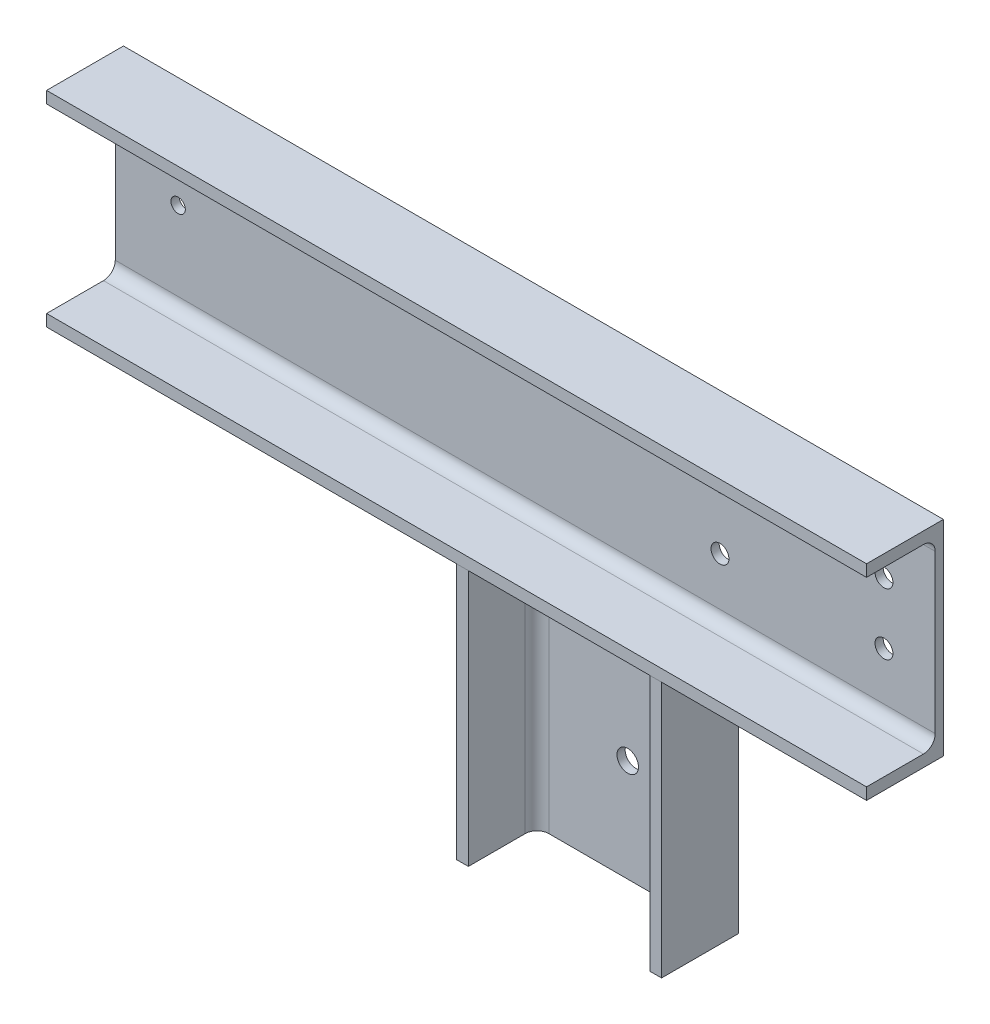
ISO-10303-21;
HEADER;
FILE_DESCRIPTION(('STEP AP214'),'2;1');
FILE_NAME('part.step','',(''),(''),'','','');
FILE_SCHEMA(('AUTOMOTIVE_DESIGN { 1 0 10303 214 1 1 1 1 }'));
ENDSEC;
DATA;
#1=APPLICATION_CONTEXT('core data for automotive mechanical design processes');
#2=APPLICATION_PROTOCOL_DEFINITION('international standard','automotive_design',2000,#1);
#3=PRODUCT_CONTEXT('',#1,'mechanical');
#4=PRODUCT('Part','Part','',(#3));
#5=PRODUCT_RELATED_PRODUCT_CATEGORY('part','',(#4));
#6=PRODUCT_DEFINITION_FORMATION('','',#4);
#7=PRODUCT_DEFINITION_CONTEXT('part definition',#1,'design');
#8=PRODUCT_DEFINITION('design','',#6,#7);
#9=PRODUCT_DEFINITION_SHAPE('','',#8);
#10=(LENGTH_UNIT() NAMED_UNIT(*) SI_UNIT(.MILLI.,.METRE.));
#11=(NAMED_UNIT(*) PLANE_ANGLE_UNIT() SI_UNIT($,.RADIAN.));
#12=(NAMED_UNIT(*) SI_UNIT($,.STERADIAN.) SOLID_ANGLE_UNIT());
#13=UNCERTAINTY_MEASURE_WITH_UNIT(LENGTH_MEASURE(1.E-05),#10,'distance_accuracy_value','');
#14=(GEOMETRIC_REPRESENTATION_CONTEXT(3) GLOBAL_UNCERTAINTY_ASSIGNED_CONTEXT((#13)) GLOBAL_UNIT_ASSIGNED_CONTEXT((#10,
#11,#12)) REPRESENTATION_CONTEXT('',''));
#15=CARTESIAN_POINT('',(0.,0.,0.));
#16=DIRECTION('',(0.,0.,1.));
#17=DIRECTION('',(1.,0.,0.));
#18=AXIS2_PLACEMENT_3D('',#15,#16,#17);
#19=CARTESIAN_POINT('',(200.,-250.,75.));
#20=DIRECTION('',(-1.,0.,0.));
#21=DIRECTION('',(0.,0.,1.));
#22=AXIS2_PLACEMENT_3D('',#19,#20,#21);
#23=PLANE('',#22);
#24=DIRECTION('',(0.,0.,1.));
#25=VECTOR('',#24,1.);
#26=CARTESIAN_POINT('',(200.,0.,75.));
#27=LINE('',#26,#25);
#28=CARTESIAN_POINT('',(200.,0.,0.));
#29=VERTEX_POINT('',#28);
#30=CARTESIAN_POINT('',(200.,0.,75.));
#31=VERTEX_POINT('',#30);
#32=EDGE_CURVE('E221',#29,#31,#27,.T.);
#33=ORIENTED_EDGE('',*,*,#32,.T.);
#34=DIRECTION('',(0.,1.,0.));
#35=VECTOR('',#34,1.);
#36=CARTESIAN_POINT('',(200.,-250.,75.));
#37=LINE('',#36,#35);
#38=CARTESIAN_POINT('',(200.,-250.,75.));
#39=VERTEX_POINT('',#38);
#40=EDGE_CURVE('E14',#39,#31,#37,.T.);
#41=ORIENTED_EDGE('',*,*,#40,.F.);
#42=DIRECTION('',(0.,0.,1.));
#43=VECTOR('',#42,1.);
#44=CARTESIAN_POINT('',(200.,-250.,75.));
#45=LINE('',#44,#43);
#46=CARTESIAN_POINT('',(200.,-250.,0.));
#47=VERTEX_POINT('',#46);
#48=EDGE_CURVE('E240',#47,#39,#45,.T.);
#49=ORIENTED_EDGE('',*,*,#48,.F.);
#50=DIRECTION('',(0.,1.,0.));
#51=VECTOR('',#50,1.);
#52=CARTESIAN_POINT('',(200.,-250.,0.));
#53=LINE('',#52,#51);
#54=EDGE_CURVE('E217',#47,#29,#53,.T.);
#55=ORIENTED_EDGE('',*,*,#54,.T.);
#56=EDGE_LOOP('',(#33,#41,#49,#55));
#57=FACE_BOUND('',#56,.T.);
#58=ADVANCED_FACE('F113',(#57),#23,.F.);
#59=CARTESIAN_POINT('',(200.,-250.,75.));
#60=DIRECTION('',(0.,0.,-1.));
#61=DIRECTION('',(-1.,0.,0.));
#62=AXIS2_PLACEMENT_3D('',#59,#60,#61);
#63=PLANE('',#62);
#64=DIRECTION('',(-1.,0.,0.));
#65=VECTOR('',#64,1.);
#66=CARTESIAN_POINT('',(200.,0.,75.));
#67=LINE('',#66,#65);
#68=CARTESIAN_POINT('',(188.5,0.,74.9999999999999));
#69=VERTEX_POINT('',#68);
#70=EDGE_CURVE('E224',#31,#69,#67,.T.);
#71=ORIENTED_EDGE('',*,*,#70,.T.);
#72=DIRECTION('',(0.,1.,0.));
#73=VECTOR('',#72,1.);
#74=CARTESIAN_POINT('',(188.5,-250.,74.9999999999999));
#75=LINE('',#74,#73);
#76=CARTESIAN_POINT('',(188.5,-250.,74.9999999999999));
#77=VERTEX_POINT('',#76);
#78=EDGE_CURVE('E121',#77,#69,#75,.T.);
#79=ORIENTED_EDGE('',*,*,#78,.F.);
#80=DIRECTION('',(-1.,0.,0.));
#81=VECTOR('',#80,1.);
#82=CARTESIAN_POINT('',(200.,-250.,75.));
#83=LINE('',#82,#81);
#84=EDGE_CURVE('E178',#39,#77,#83,.T.);
#85=ORIENTED_EDGE('',*,*,#84,.F.);
#86=ORIENTED_EDGE('',*,*,#40,.T.);
#87=EDGE_LOOP('',(#71,#79,#85,#86));
#88=FACE_BOUND('',#87,.T.);
#89=ADVANCED_FACE('F307',(#88),#63,.F.);
#90=CARTESIAN_POINT('',(188.5,-250.,19.4999999999999));
#91=DIRECTION('',(1.,0.,0.));
#92=DIRECTION('',(0.,0.,-1.));
#93=AXIS2_PLACEMENT_3D('',#90,#91,#92);
#94=PLANE('',#93);
#95=DIRECTION('',(0.,0.,-1.));
#96=VECTOR('',#95,1.);
#97=CARTESIAN_POINT('',(188.5,0.,19.4999999999999));
#98=LINE('',#97,#96);
#99=CARTESIAN_POINT('',(188.5,0.,19.4999999999999));
#100=VERTEX_POINT('',#99);
#101=EDGE_CURVE('E227',#69,#100,#98,.T.);
#102=ORIENTED_EDGE('',*,*,#101,.T.);
#103=DIRECTION('',(0.,1.,0.));
#104=VECTOR('',#103,1.);
#105=CARTESIAN_POINT('',(188.5,-250.,19.4999999999999));
#106=LINE('',#105,#104);
#107=CARTESIAN_POINT('',(188.5,-250.,19.4999999999999));
#108=VERTEX_POINT('',#107);
#109=EDGE_CURVE('E253',#108,#100,#106,.T.);
#110=ORIENTED_EDGE('',*,*,#109,.F.);
#111=DIRECTION('',(0.,0.,-1.));
#112=VECTOR('',#111,1.);
#113=CARTESIAN_POINT('',(188.5,-250.,19.4999999999999));
#114=LINE('',#113,#112);
#115=EDGE_CURVE('E261',#77,#108,#114,.T.);
#116=ORIENTED_EDGE('',*,*,#115,.F.);
#117=ORIENTED_EDGE('',*,*,#78,.T.);
#118=EDGE_LOOP('',(#102,#110,#116,#117));
#119=FACE_BOUND('',#118,.T.);
#120=ADVANCED_FACE('F259',(#119),#94,.F.);
#121=CARTESIAN_POINT('',(177.,-250.,19.4999999999999));
#122=DIRECTION('',(0.,1.,0.));
#123=DIRECTION('',(-1.,0.,0.));
#124=AXIS2_PLACEMENT_3D('',#121,#122,#123);
#125=CYLINDRICAL_SURFACE('',#124,11.5);
#126=CARTESIAN_POINT('',(177.,0.,19.4999999999999));
#127=DIRECTION('',(0.,1.,0.));
#128=DIRECTION('',(-1.,0.,0.));
#129=AXIS2_PLACEMENT_3D('',#126,#127,#128);
#130=CIRCLE('',#129,11.5);
#131=CARTESIAN_POINT('',(177.,0.,7.9999999999999));
#132=VERTEX_POINT('',#131);
#133=EDGE_CURVE('E229',#100,#132,#130,.T.);
#134=ORIENTED_EDGE('',*,*,#133,.T.);
#135=DIRECTION('',(0.,1.,0.));
#136=VECTOR('',#135,1.);
#137=CARTESIAN_POINT('',(177.,-250.,7.9999999999999));
#138=LINE('',#137,#136);
#139=CARTESIAN_POINT('',(177.,-250.,7.9999999999999));
#140=VERTEX_POINT('',#139);
#141=EDGE_CURVE('E250',#140,#132,#138,.T.);
#142=ORIENTED_EDGE('',*,*,#141,.F.);
#143=CARTESIAN_POINT('',(177.,-250.,19.4999999999999));
#144=DIRECTION('',(0.,1.,0.));
#145=DIRECTION('',(-1.,0.,0.));
#146=AXIS2_PLACEMENT_3D('',#143,#144,#145);
#147=CIRCLE('',#146,11.5);
#148=EDGE_CURVE('E279',#108,#140,#147,.T.);
#149=ORIENTED_EDGE('',*,*,#148,.F.);
#150=ORIENTED_EDGE('',*,*,#109,.T.);
#151=EDGE_LOOP('',(#134,#142,#149,#150));
#152=FACE_BOUND('',#151,.T.);
#153=ADVANCED_FACE('F270',(#152),#125,.F.);
#154=CARTESIAN_POINT('',(23.0000000000001,-250.,7.99999999999934));
#155=DIRECTION('',(0.,0.,-1.));
#156=DIRECTION('',(-1.,0.,0.));
#157=AXIS2_PLACEMENT_3D('',#154,#155,#156);
#158=PLANE('',#157);
#159=CARTESIAN_POINT('',(100.,-150.,7.99999999999925));
#160=DIRECTION('',(0.,0.,1.));
#161=DIRECTION('',(1.,0.,0.));
#162=AXIS2_PLACEMENT_3D('',#159,#160,#161);
#163=CIRCLE('',#162,10.5);
#164=CARTESIAN_POINT('',(110.5,-150.,7.99999999999925));
#165=VERTEX_POINT('',#164);
#166=EDGE_CURVE('E289',#165,#165,#163,.T.);
#167=ORIENTED_EDGE('',*,*,#166,.F.);
#168=EDGE_LOOP('',(#167));
#169=FACE_BOUND('',#168,.T.);
#170=DIRECTION('',(-1.,0.,0.));
#171=VECTOR('',#170,1.);
#172=CARTESIAN_POINT('',(23.,-1.15201697244113E-13,7.99999999999934));
#173=LINE('',#172,#171);
#174=CARTESIAN_POINT('',(23.,-1.15201697244113E-13,7.99999999999932));
#175=VERTEX_POINT('',#174);
#176=EDGE_CURVE('E231',#132,#175,#173,.T.);
#177=ORIENTED_EDGE('',*,*,#176,.T.);
#178=DIRECTION('',(0.,1.,0.));
#179=VECTOR('',#178,1.);
#180=CARTESIAN_POINT('',(23.0000000000001,-250.,7.99999999999932));
#181=LINE('',#180,#179);
#182=CARTESIAN_POINT('',(23.0000000000001,-250.,7.99999999999932));
#183=VERTEX_POINT('',#182);
#184=EDGE_CURVE('E247',#183,#175,#181,.T.);
#185=ORIENTED_EDGE('',*,*,#184,.F.);
#186=DIRECTION('',(-1.,0.,0.));
#187=VECTOR('',#186,1.);
#188=CARTESIAN_POINT('',(23.0000000000001,-250.,7.99999999999934));
#189=LINE('',#188,#187);
#190=EDGE_CURVE('E276',#140,#183,#189,.T.);
#191=ORIENTED_EDGE('',*,*,#190,.F.);
#192=ORIENTED_EDGE('',*,*,#141,.T.);
#193=EDGE_LOOP('',(#177,#185,#191,#192));
#194=FACE_BOUND('',#193,.T.);
#195=ADVANCED_FACE('F274',(#169,#194),#158,.F.);
#196=CARTESIAN_POINT('',(23.0000000000001,-250.,19.4999999999993));
#197=DIRECTION('',(0.,1.,0.));
#198=DIRECTION('',(-1.,0.,0.));
#199=AXIS2_PLACEMENT_3D('',#196,#197,#198);
#200=CYLINDRICAL_SURFACE('',#199,11.5);
#201=CARTESIAN_POINT('',(23.,-1.15201697244113E-13,19.4999999999993));
#202=DIRECTION('',(0.,1.,0.));
#203=DIRECTION('',(-1.,0.,0.));
#204=AXIS2_PLACEMENT_3D('',#201,#202,#203);
#205=CIRCLE('',#204,11.5);
#206=CARTESIAN_POINT('',(11.5,-1.17116831961591E-13,19.4999999999993));
#207=VERTEX_POINT('',#206);
#208=EDGE_CURVE('E233',#175,#207,#205,.T.);
#209=ORIENTED_EDGE('',*,*,#208,.T.);
#210=DIRECTION('',(0.,1.,0.));
#211=VECTOR('',#210,1.);
#212=CARTESIAN_POINT('',(11.5,-250.,19.4999999999993));
#213=LINE('',#212,#211);
#214=CARTESIAN_POINT('',(11.5,-250.,19.4999999999993));
#215=VERTEX_POINT('',#214);
#216=EDGE_CURVE('E244',#215,#207,#213,.T.);
#217=ORIENTED_EDGE('',*,*,#216,.F.);
#218=CARTESIAN_POINT('',(23.0000000000001,-250.,19.4999999999993));
#219=DIRECTION('',(0.,1.,0.));
#220=DIRECTION('',(-1.,0.,0.));
#221=AXIS2_PLACEMENT_3D('',#218,#219,#220);
#222=CIRCLE('',#221,11.5);
#223=EDGE_CURVE('E278',#183,#215,#222,.T.);
#224=ORIENTED_EDGE('',*,*,#223,.F.);
#225=ORIENTED_EDGE('',*,*,#184,.T.);
#226=EDGE_LOOP('',(#209,#217,#224,#225));
#227=FACE_BOUND('',#226,.T.);
#228=ADVANCED_FACE('F296',(#227),#200,.F.);
#229=CARTESIAN_POINT('',(11.5,-250.,19.4999999999993));
#230=DIRECTION('',(-1.,0.,0.));
#231=DIRECTION('',(0.,0.,1.));
#232=AXIS2_PLACEMENT_3D('',#229,#230,#231);
#233=PLANE('',#232);
#234=DIRECTION('',(0.,0.,1.));
#235=VECTOR('',#234,1.);
#236=CARTESIAN_POINT('',(11.5,-1.17116831961591E-13,19.4999999999993));
#237=LINE('',#236,#235);
#238=CARTESIAN_POINT('',(11.4999999999998,-1.17116831961591E-13,74.9999999999993));
#239=VERTEX_POINT('',#238);
#240=EDGE_CURVE('E235',#207,#239,#237,.T.);
#241=ORIENTED_EDGE('',*,*,#240,.T.);
#242=DIRECTION('',(0.,1.,0.));
#243=VECTOR('',#242,1.);
#244=CARTESIAN_POINT('',(11.4999999999998,-250.,74.9999999999993));
#245=LINE('',#244,#243);
#246=CARTESIAN_POINT('',(11.4999999999998,-250.,74.9999999999993));
#247=VERTEX_POINT('',#246);
#248=EDGE_CURVE('E212',#247,#239,#245,.T.);
#249=ORIENTED_EDGE('',*,*,#248,.F.);
#250=DIRECTION('',(0.,0.,1.));
#251=VECTOR('',#250,1.);
#252=CARTESIAN_POINT('',(11.5,-250.,19.4999999999993));
#253=LINE('',#252,#251);
#254=EDGE_CURVE('E203',#215,#247,#253,.T.);
#255=ORIENTED_EDGE('',*,*,#254,.F.);
#256=ORIENTED_EDGE('',*,*,#216,.T.);
#257=EDGE_LOOP('',(#241,#249,#255,#256));
#258=FACE_BOUND('',#257,.T.);
#259=ADVANCED_FACE('F302',(#258),#233,.F.);
#260=CARTESIAN_POINT('',(-1.52655665885959E-13,-250.,74.9999999999992));
#261=DIRECTION('',(0.,0.,-1.));
#262=DIRECTION('',(-1.,0.,0.));
#263=AXIS2_PLACEMENT_3D('',#260,#261,#262);
#264=PLANE('',#263);
#265=DIRECTION('',(-1.,0.,0.));
#266=VECTOR('',#265,1.);
#267=CARTESIAN_POINT('',(-1.94289029309402E-13,-1.19031966679069E-13,74.9999999999992));
#268=LINE('',#267,#266);
#269=CARTESIAN_POINT('',(-1.94289029309402E-13,-1.19031966679069E-13,74.9999999999992));
#270=VERTEX_POINT('',#269);
#271=EDGE_CURVE('E211',#239,#270,#268,.T.);
#272=ORIENTED_EDGE('',*,*,#271,.T.);
#273=DIRECTION('',(0.,1.,0.));
#274=VECTOR('',#273,1.);
#275=CARTESIAN_POINT('',(-1.52655665885959E-13,-250.,74.9999999999992));
#276=LINE('',#275,#274);
#277=CARTESIAN_POINT('',(-1.52655665885959E-13,-250.,74.9999999999992));
#278=VERTEX_POINT('',#277);
#279=EDGE_CURVE('E208',#278,#270,#276,.T.);
#280=ORIENTED_EDGE('',*,*,#279,.F.);
#281=DIRECTION('',(-1.,0.,0.));
#282=VECTOR('',#281,1.);
#283=CARTESIAN_POINT('',(-1.52655665885959E-13,-250.,74.9999999999992));
#284=LINE('',#283,#282);
#285=EDGE_CURVE('E197',#247,#278,#284,.T.);
#286=ORIENTED_EDGE('',*,*,#285,.F.);
#287=ORIENTED_EDGE('',*,*,#248,.T.);
#288=EDGE_LOOP('',(#272,#280,#286,#287));
#289=FACE_BOUND('',#288,.T.);
#290=ADVANCED_FACE('F209',(#289),#264,.F.);
#291=CARTESIAN_POINT('',(-1.52655665885959E-13,-250.,74.9999999999992));
#292=DIRECTION('',(1.,0.,0.));
#293=DIRECTION('',(0.,0.,-1.));
#294=AXIS2_PLACEMENT_3D('',#291,#292,#293);
#295=PLANE('',#294);
#296=DIRECTION('',(0.,0.,-1.));
#297=VECTOR('',#296,1.);
#298=CARTESIAN_POINT('',(-1.94289029309402E-13,-1.19031966679069E-13,74.9999999999992));
#299=LINE('',#298,#297);
#300=CARTESIAN_POINT('',(0.,-1.19031966679069E-13,-7.53807418999884E-13));
#301=VERTEX_POINT('',#300);
#302=EDGE_CURVE('E164',#270,#301,#299,.T.);
#303=ORIENTED_EDGE('',*,*,#302,.T.);
#304=DIRECTION('',(0.,1.,0.));
#305=VECTOR('',#304,1.);
#306=CARTESIAN_POINT('',(0.,-250.,-7.53807418999884E-13));
#307=LINE('',#306,#305);
#308=CARTESIAN_POINT('',(0.,-250.,-7.53807418999884E-13));
#309=VERTEX_POINT('',#308);
#310=EDGE_CURVE('E213',#309,#301,#307,.T.);
#311=ORIENTED_EDGE('',*,*,#310,.F.);
#312=DIRECTION('',(0.,0.,-1.));
#313=VECTOR('',#312,1.);
#314=CARTESIAN_POINT('',(-1.52655665885959E-13,-250.,74.9999999999992));
#315=LINE('',#314,#313);
#316=EDGE_CURVE('E201',#278,#309,#315,.T.);
#317=ORIENTED_EDGE('',*,*,#316,.F.);
#318=ORIENTED_EDGE('',*,*,#279,.T.);
#319=EDGE_LOOP('',(#303,#311,#317,#318));
#320=FACE_BOUND('',#319,.T.);
#321=ADVANCED_FACE('F215',(#320),#295,.F.);
#322=CARTESIAN_POINT('',(200.,-250.,0.));
#323=DIRECTION('',(0.,0.,1.));
#324=DIRECTION('',(1.,0.,0.));
#325=AXIS2_PLACEMENT_3D('',#322,#323,#324);
#326=PLANE('',#325);
#327=CARTESIAN_POINT('',(100.,-150.,-7.56339435525888E-13));
#328=DIRECTION('',(0.,0.,1.));
#329=DIRECTION('',(1.,0.,0.));
#330=AXIS2_PLACEMENT_3D('',#327,#328,#329);
#331=CIRCLE('',#330,10.5);
#332=CARTESIAN_POINT('',(110.5,-150.,-7.56339435525888E-13));
#333=VERTEX_POINT('',#332);
#334=EDGE_CURVE('E225',#333,#333,#331,.T.);
#335=ORIENTED_EDGE('',*,*,#334,.T.);
#336=EDGE_LOOP('',(#335));
#337=FACE_BOUND('',#336,.T.);
#338=DIRECTION('',(1.,0.,0.));
#339=VECTOR('',#338,1.);
#340=CARTESIAN_POINT('',(200.,0.,0.));
#341=LINE('',#340,#339);
#342=EDGE_CURVE('E170',#301,#29,#341,.T.);
#343=ORIENTED_EDGE('',*,*,#342,.T.);
#344=ORIENTED_EDGE('',*,*,#54,.F.);
#345=DIRECTION('',(1.,0.,0.));
#346=VECTOR('',#345,1.);
#347=CARTESIAN_POINT('',(200.,-250.,0.));
#348=LINE('',#347,#346);
#349=EDGE_CURVE('E129',#309,#47,#348,.T.);
#350=ORIENTED_EDGE('',*,*,#349,.F.);
#351=ORIENTED_EDGE('',*,*,#310,.T.);
#352=EDGE_LOOP('',(#343,#344,#350,#351));
#353=FACE_BOUND('',#352,.T.);
#354=ADVANCED_FACE('F326',(#337,#353),#326,.F.);
#355=CARTESIAN_POINT('',(23.0000000000001,-250.,19.4999999999993));
#356=DIRECTION('',(0.,1.,0.));
#357=DIRECTION('',(-1.,0.,0.));
#358=AXIS2_PLACEMENT_3D('',#355,#356,#357);
#359=PLANE('',#358);
#360=ORIENTED_EDGE('',*,*,#48,.T.);
#361=ORIENTED_EDGE('',*,*,#84,.T.);
#362=ORIENTED_EDGE('',*,*,#115,.T.);
#363=ORIENTED_EDGE('',*,*,#148,.T.);
#364=ORIENTED_EDGE('',*,*,#190,.T.);
#365=ORIENTED_EDGE('',*,*,#223,.T.);
#366=ORIENTED_EDGE('',*,*,#254,.T.);
#367=ORIENTED_EDGE('',*,*,#285,.T.);
#368=ORIENTED_EDGE('',*,*,#316,.T.);
#369=ORIENTED_EDGE('',*,*,#349,.T.);
#370=EDGE_LOOP('',(#360,#361,#362,#363,#364,#365,#366,#367,#368,#369));
#371=FACE_BOUND('',#370,.T.);
#372=ADVANCED_FACE('F199',(#371),#359,.F.);
#373=CARTESIAN_POINT('',(23.,-1.15201697244113E-13,19.4999999999993));
#374=DIRECTION('',(0.,1.,0.));
#375=DIRECTION('',(-1.,0.,0.));
#376=AXIS2_PLACEMENT_3D('',#373,#374,#375);
#377=PLANE('',#376);
#378=ORIENTED_EDGE('',*,*,#32,.F.);
#379=ORIENTED_EDGE('',*,*,#342,.F.);
#380=ORIENTED_EDGE('',*,*,#302,.F.);
#381=ORIENTED_EDGE('',*,*,#271,.F.);
#382=ORIENTED_EDGE('',*,*,#240,.F.);
#383=ORIENTED_EDGE('',*,*,#208,.F.);
#384=ORIENTED_EDGE('',*,*,#176,.F.);
#385=ORIENTED_EDGE('',*,*,#133,.F.);
#386=ORIENTED_EDGE('',*,*,#101,.F.);
#387=ORIENTED_EDGE('',*,*,#70,.F.);
#388=EDGE_LOOP('',(#378,#379,#380,#381,#382,#383,#384,#385,#386,#387));
#389=FACE_BOUND('',#388,.T.);
#390=ADVANCED_FACE('F265',(#389),#377,.T.);
#391=CARTESIAN_POINT('',(100.,-150.,7.99999999999925));
#392=DIRECTION('',(0.,0.,1.));
#393=DIRECTION('',(1.,0.,0.));
#394=AXIS2_PLACEMENT_3D('',#391,#392,#393);
#395=CYLINDRICAL_SURFACE('',#394,10.5);
#396=ORIENTED_EDGE('',*,*,#334,.F.);
#397=EDGE_LOOP('',(#396));
#398=FACE_BOUND('',#397,.T.);
#399=ORIENTED_EDGE('',*,*,#166,.T.);
#400=EDGE_LOOP('',(#399));
#401=FACE_BOUND('',#400,.T.);
#402=ADVANCED_FACE('F293',(#398,#401),#395,.F.);
#403=CLOSED_SHELL('',(#58,#89,#120,#153,#195,#228,#259,#290,#321,#354,#372,#390,#402));
#404=MANIFOLD_SOLID_BREP('B2',#403);
#405=CARTESIAN_POINT('',(-400.,1.58990769284857E-13,75.));
#406=DIRECTION('',(0.,1.,0.));
#407=DIRECTION('',(0.,0.,1.));
#408=AXIS2_PLACEMENT_3D('',#405,#406,#407);
#409=PLANE('',#408);
#410=DIRECTION('',(0.,0.,1.));
#411=VECTOR('',#410,1.);
#412=CARTESIAN_POINT('',(400.,4.03920129114328E-13,75.));
#413=LINE('',#412,#411);
#414=CARTESIAN_POINT('',(400.,1.40834381901946E-13,0.));
#415=VERTEX_POINT('',#414);
#416=CARTESIAN_POINT('',(400.,4.03920129114328E-13,75.));
#417=VERTEX_POINT('',#416);
#418=EDGE_CURVE('E574',#415,#417,#413,.T.);
#419=ORIENTED_EDGE('',*,*,#418,.T.);
#420=DIRECTION('',(1.,0.,0.));
#421=VECTOR('',#420,1.);
#422=CARTESIAN_POINT('',(-400.,1.58990769284857E-13,75.));
#423=LINE('',#422,#421);
#424=CARTESIAN_POINT('',(-400.,1.58990769284857E-13,75.));
#425=VERTEX_POINT('',#424);
#426=EDGE_CURVE('E111',#425,#417,#423,.T.);
#427=ORIENTED_EDGE('',*,*,#426,.F.);
#428=DIRECTION('',(0.,0.,1.));
#429=VECTOR('',#428,1.);
#430=CARTESIAN_POINT('',(-400.,1.58990769284857E-13,75.));
#431=LINE('',#430,#429);
#432=CARTESIAN_POINT('',(-400.,-1.04094977927525E-13,0.));
#433=VERTEX_POINT('',#432);
#434=EDGE_CURVE('E593',#433,#425,#431,.T.);
#435=ORIENTED_EDGE('',*,*,#434,.F.);
#436=DIRECTION('',(1.,0.,0.));
#437=VECTOR('',#436,1.);
#438=CARTESIAN_POINT('',(-400.,-1.04094977927525E-13,0.));
#439=LINE('',#438,#437);
#440=EDGE_CURVE('E570',#433,#415,#439,.T.);
#441=ORIENTED_EDGE('',*,*,#440,.T.);
#442=EDGE_LOOP('',(#419,#427,#435,#441));
#443=FACE_BOUND('',#442,.T.);
#444=ADVANCED_FACE('F464',(#443),#409,.F.);
#445=CARTESIAN_POINT('',(-400.,1.58990769284857E-13,75.));
#446=DIRECTION('',(0.,0.,-1.));
#447=DIRECTION('',(0.,1.,0.));
#448=AXIS2_PLACEMENT_3D('',#445,#446,#447);
#449=PLANE('',#448);
#450=DIRECTION('',(0.,1.,0.));
#451=VECTOR('',#450,1.);
#452=CARTESIAN_POINT('',(400.,4.03920129114328E-13,75.));
#453=LINE('',#452,#451);
#454=CARTESIAN_POINT('',(400.,11.5000000000004,74.9999999999999));
#455=VERTEX_POINT('',#454);
#456=EDGE_CURVE('E577',#417,#455,#453,.T.);
#457=ORIENTED_EDGE('',*,*,#456,.T.);
#458=DIRECTION('',(1.,0.,0.));
#459=VECTOR('',#458,1.);
#460=CARTESIAN_POINT('',(-400.,11.5000000000002,74.9999999999999));
#461=LINE('',#460,#459);
#462=CARTESIAN_POINT('',(-400.,11.5000000000002,74.9999999999999));
#463=VERTEX_POINT('',#462);
#464=EDGE_CURVE('E473',#463,#455,#461,.T.);
#465=ORIENTED_EDGE('',*,*,#464,.F.);
#466=DIRECTION('',(0.,1.,0.));
#467=VECTOR('',#466,1.);
#468=CARTESIAN_POINT('',(-400.,1.58990769284857E-13,75.));
#469=LINE('',#468,#467);
#470=EDGE_CURVE('E531',#425,#463,#469,.T.);
#471=ORIENTED_EDGE('',*,*,#470,.F.);
#472=ORIENTED_EDGE('',*,*,#426,.T.);
#473=EDGE_LOOP('',(#457,#465,#471,#472));
#474=FACE_BOUND('',#473,.T.);
#475=ADVANCED_FACE('F678',(#474),#449,.F.);
#476=CARTESIAN_POINT('',(-400.,11.5,19.4999999999999));
#477=DIRECTION('',(0.,-1.,0.));
#478=DIRECTION('',(0.,0.,-1.));
#479=AXIS2_PLACEMENT_3D('',#476,#477,#478);
#480=PLANE('',#479);
#481=DIRECTION('',(0.,0.,-1.));
#482=VECTOR('',#481,1.);
#483=CARTESIAN_POINT('',(400.,11.5000000000002,19.4999999999999));
#484=LINE('',#483,#482);
#485=CARTESIAN_POINT('',(400.,11.5000000000002,19.4999999999999));
#486=VERTEX_POINT('',#485);
#487=EDGE_CURVE('E580',#455,#486,#484,.T.);
#488=ORIENTED_EDGE('',*,*,#487,.T.);
#489=DIRECTION('',(1.,0.,0.));
#490=VECTOR('',#489,1.);
#491=CARTESIAN_POINT('',(-400.,11.5,19.4999999999999));
#492=LINE('',#491,#490);
#493=CARTESIAN_POINT('',(-400.,11.5,19.4999999999999));
#494=VERTEX_POINT('',#493);
#495=EDGE_CURVE('E606',#494,#486,#492,.T.);
#496=ORIENTED_EDGE('',*,*,#495,.F.);
#497=DIRECTION('',(0.,0.,-1.));
#498=VECTOR('',#497,1.);
#499=CARTESIAN_POINT('',(-400.,11.5,19.4999999999999));
#500=LINE('',#499,#498);
#501=EDGE_CURVE('E642',#463,#494,#500,.T.);
#502=ORIENTED_EDGE('',*,*,#501,.F.);
#503=ORIENTED_EDGE('',*,*,#464,.T.);
#504=EDGE_LOOP('',(#488,#496,#502,#503));
#505=FACE_BOUND('',#504,.T.);
#506=ADVANCED_FACE('F682',(#505),#480,.F.);
#507=CARTESIAN_POINT('',(-400.,23.,19.4999999999999));
#508=DIRECTION('',(1.,0.,0.));
#509=DIRECTION('',(0.,1.,0.));
#510=AXIS2_PLACEMENT_3D('',#507,#508,#509);
#511=CYLINDRICAL_SURFACE('',#510,11.5);
#512=CARTESIAN_POINT('',(400.,23.0000000000002,19.4999999999999));
#513=DIRECTION('',(1.,0.,0.));
#514=DIRECTION('',(0.,1.,0.));
#515=AXIS2_PLACEMENT_3D('',#512,#513,#514);
#516=CIRCLE('',#515,11.5);
#517=CARTESIAN_POINT('',(400.,23.0000000000002,7.99999999999989));
#518=VERTEX_POINT('',#517);
#519=EDGE_CURVE('E582',#486,#518,#516,.T.);
#520=ORIENTED_EDGE('',*,*,#519,.T.);
#521=DIRECTION('',(1.,0.,0.));
#522=VECTOR('',#521,1.);
#523=CARTESIAN_POINT('',(-400.,22.9999999999999,7.99999999999989));
#524=LINE('',#523,#522);
#525=CARTESIAN_POINT('',(-400.,22.9999999999999,7.99999999999989));
#526=VERTEX_POINT('',#525);
#527=EDGE_CURVE('E603',#526,#518,#524,.T.);
#528=ORIENTED_EDGE('',*,*,#527,.F.);
#529=CARTESIAN_POINT('',(-400.,23.,19.4999999999999));
#530=DIRECTION('',(1.,0.,0.));
#531=DIRECTION('',(0.,1.,0.));
#532=AXIS2_PLACEMENT_3D('',#529,#530,#531);
#533=CIRCLE('',#532,11.5);
#534=EDGE_CURVE('E644',#494,#526,#533,.T.);
#535=ORIENTED_EDGE('',*,*,#534,.F.);
#536=ORIENTED_EDGE('',*,*,#495,.T.);
#537=EDGE_LOOP('',(#520,#528,#535,#536));
#538=FACE_BOUND('',#537,.T.);
#539=ADVANCED_FACE('F686',(#538),#511,.F.);
#540=CARTESIAN_POINT('',(-400.,177.,7.99999999999934));
#541=DIRECTION('',(0.,0.,-1.));
#542=DIRECTION('',(0.,1.,0.));
#543=AXIS2_PLACEMENT_3D('',#540,#541,#542);
#544=PLANE('',#543);
#545=CARTESIAN_POINT('',(190.,130.,7.99999999999998));
#546=DIRECTION('',(0.,0.,1.));
#547=DIRECTION('',(1.,0.,0.));
#548=AXIS2_PLACEMENT_3D('',#545,#546,#547);
#549=CIRCLE('',#548,8.74999999999998);
#550=CARTESIAN_POINT('',(198.75,130.,7.99999999999998));
#551=VERTEX_POINT('',#550);
#552=EDGE_CURVE('E631',#551,#551,#549,.T.);
#553=ORIENTED_EDGE('',*,*,#552,.F.);
#554=EDGE_LOOP('',(#553));
#555=FACE_BOUND('',#554,.T.);
#556=CARTESIAN_POINT('',(350.,130.,7.99999999999998));
#557=DIRECTION('',(0.,0.,1.));
#558=DIRECTION('',(1.,0.,0.));
#559=AXIS2_PLACEMENT_3D('',#556,#557,#558);
#560=CIRCLE('',#559,8.74999999999998);
#561=CARTESIAN_POINT('',(358.75,130.,7.99999999999998));
#562=VERTEX_POINT('',#561);
#563=EDGE_CURVE('E621',#562,#562,#560,.T.);
#564=ORIENTED_EDGE('',*,*,#563,.F.);
#565=EDGE_LOOP('',(#564));
#566=FACE_BOUND('',#565,.T.);
#567=CARTESIAN_POINT('',(350.,70.0000000000002,7.99999999999998));
#568=DIRECTION('',(0.,0.,1.));
#569=DIRECTION('',(1.,0.,0.));
#570=AXIS2_PLACEMENT_3D('',#567,#568,#569);
#571=CIRCLE('',#570,8.74999999999998);
#572=CARTESIAN_POINT('',(358.75,70.0000000000002,7.99999999999998));
#573=VERTEX_POINT('',#572);
#574=EDGE_CURVE('E618',#573,#573,#571,.T.);
#575=ORIENTED_EDGE('',*,*,#574,.F.);
#576=EDGE_LOOP('',(#575));
#577=FACE_BOUND('',#576,.T.);
#578=CARTESIAN_POINT('',(190.,70.0000000000002,7.99999999999998));
#579=DIRECTION('',(0.,0.,1.));
#580=DIRECTION('',(1.,0.,0.));
#581=AXIS2_PLACEMENT_3D('',#578,#579,#580);
#582=CIRCLE('',#581,8.74999999999998);
#583=CARTESIAN_POINT('',(198.75,70.0000000000002,7.99999999999998));
#584=VERTEX_POINT('',#583);
#585=EDGE_CURVE('E615',#584,#584,#582,.T.);
#586=ORIENTED_EDGE('',*,*,#585,.F.);
#587=EDGE_LOOP('',(#586));
#588=FACE_BOUND('',#587,.T.);
#589=CARTESIAN_POINT('',(-338.671963181577,100.,7.99999999999998));
#590=DIRECTION('',(0.,0.,1.));
#591=DIRECTION('',(1.,0.,0.));
#592=AXIS2_PLACEMENT_3D('',#589,#590,#591);
#593=CIRCLE('',#592,7.00000000000001);
#594=CARTESIAN_POINT('',(-331.671963181577,100.,7.99999999999998));
#595=VERTEX_POINT('',#594);
#596=EDGE_CURVE('E614',#595,#595,#593,.T.);
#597=ORIENTED_EDGE('',*,*,#596,.F.);
#598=EDGE_LOOP('',(#597));
#599=FACE_BOUND('',#598,.T.);
#600=DIRECTION('',(0.,1.,0.));
#601=VECTOR('',#600,1.);
#602=CARTESIAN_POINT('',(400.,177.,7.99999999999934));
#603=LINE('',#602,#601);
#604=CARTESIAN_POINT('',(400.,177.,7.99999999999932));
#605=VERTEX_POINT('',#604);
#606=EDGE_CURVE('E584',#518,#605,#603,.T.);
#607=ORIENTED_EDGE('',*,*,#606,.T.);
#608=DIRECTION('',(1.,0.,0.));
#609=VECTOR('',#608,1.);
#610=CARTESIAN_POINT('',(-400.,177.,7.99999999999932));
#611=LINE('',#610,#609);
#612=CARTESIAN_POINT('',(-400.,177.,7.99999999999932));
#613=VERTEX_POINT('',#612);
#614=EDGE_CURVE('E600',#613,#605,#611,.T.);
#615=ORIENTED_EDGE('',*,*,#614,.F.);
#616=DIRECTION('',(0.,1.,0.));
#617=VECTOR('',#616,1.);
#618=CARTESIAN_POINT('',(-400.,177.,7.99999999999934));
#619=LINE('',#618,#617);
#620=EDGE_CURVE('E646',#526,#613,#619,.T.);
#621=ORIENTED_EDGE('',*,*,#620,.F.);
#622=ORIENTED_EDGE('',*,*,#527,.T.);
#623=EDGE_LOOP('',(#607,#615,#621,#622));
#624=FACE_BOUND('',#623,.T.);
#625=ADVANCED_FACE('F692',(#555,#566,#577,#588,#599,#624),#544,.F.);
#626=CARTESIAN_POINT('',(-400.,177.,19.4999999999993));
#627=DIRECTION('',(1.,0.,0.));
#628=DIRECTION('',(0.,1.,0.));
#629=AXIS2_PLACEMENT_3D('',#626,#627,#628);
#630=CYLINDRICAL_SURFACE('',#629,11.5);
#631=CARTESIAN_POINT('',(400.,177.,19.4999999999993));
#632=DIRECTION('',(1.,0.,0.));
#633=DIRECTION('',(0.,1.,0.));
#634=AXIS2_PLACEMENT_3D('',#631,#632,#633);
#635=CIRCLE('',#634,11.5);
#636=CARTESIAN_POINT('',(400.,188.5,19.4999999999993));
#637=VERTEX_POINT('',#636);
#638=EDGE_CURVE('E586',#605,#637,#635,.T.);
#639=ORIENTED_EDGE('',*,*,#638,.T.);
#640=DIRECTION('',(1.,0.,0.));
#641=VECTOR('',#640,1.);
#642=CARTESIAN_POINT('',(-400.,188.5,19.4999999999993));
#643=LINE('',#642,#641);
#644=CARTESIAN_POINT('',(-400.,188.5,19.4999999999993));
#645=VERTEX_POINT('',#644);
#646=EDGE_CURVE('E597',#645,#637,#643,.T.);
#647=ORIENTED_EDGE('',*,*,#646,.F.);
#648=CARTESIAN_POINT('',(-400.,177.,19.4999999999993));
#649=DIRECTION('',(1.,0.,0.));
#650=DIRECTION('',(0.,1.,0.));
#651=AXIS2_PLACEMENT_3D('',#648,#649,#650);
#652=CIRCLE('',#651,11.5);
#653=EDGE_CURVE('E648',#613,#645,#652,.T.);
#654=ORIENTED_EDGE('',*,*,#653,.F.);
#655=ORIENTED_EDGE('',*,*,#614,.T.);
#656=EDGE_LOOP('',(#639,#647,#654,#655));
#657=FACE_BOUND('',#656,.T.);
#658=ADVANCED_FACE('F654',(#657),#630,.F.);
#659=CARTESIAN_POINT('',(-400.,188.5,19.4999999999993));
#660=DIRECTION('',(0.,1.,0.));
#661=DIRECTION('',(0.,0.,1.));
#662=AXIS2_PLACEMENT_3D('',#659,#660,#661);
#663=PLANE('',#662);
#664=DIRECTION('',(0.,0.,1.));
#665=VECTOR('',#664,1.);
#666=CARTESIAN_POINT('',(400.,188.5,19.4999999999993));
#667=LINE('',#666,#665);
#668=CARTESIAN_POINT('',(400.,188.5,74.9999999999993));
#669=VERTEX_POINT('',#668);
#670=EDGE_CURVE('E588',#637,#669,#667,.T.);
#671=ORIENTED_EDGE('',*,*,#670,.T.);
#672=DIRECTION('',(1.,0.,0.));
#673=VECTOR('',#672,1.);
#674=CARTESIAN_POINT('',(-400.,188.5,74.9999999999993));
#675=LINE('',#674,#673);
#676=CARTESIAN_POINT('',(-400.,188.5,74.9999999999993));
#677=VERTEX_POINT('',#676);
#678=EDGE_CURVE('E565',#677,#669,#675,.T.);
#679=ORIENTED_EDGE('',*,*,#678,.F.);
#680=DIRECTION('',(0.,0.,1.));
#681=VECTOR('',#680,1.);
#682=CARTESIAN_POINT('',(-400.,188.5,19.4999999999993));
#683=LINE('',#682,#681);
#684=EDGE_CURVE('E556',#645,#677,#683,.T.);
#685=ORIENTED_EDGE('',*,*,#684,.F.);
#686=ORIENTED_EDGE('',*,*,#646,.T.);
#687=EDGE_LOOP('',(#671,#679,#685,#686));
#688=FACE_BOUND('',#687,.T.);
#689=ADVANCED_FACE('F658',(#688),#663,.F.);
#690=CARTESIAN_POINT('',(-400.,200.,74.9999999999992));
#691=DIRECTION('',(0.,0.,-1.));
#692=DIRECTION('',(0.,1.,0.));
#693=AXIS2_PLACEMENT_3D('',#690,#691,#692);
#694=PLANE('',#693);
#695=DIRECTION('',(0.,1.,0.));
#696=VECTOR('',#695,1.);
#697=CARTESIAN_POINT('',(400.,200.,74.9999999999992));
#698=LINE('',#697,#696);
#699=CARTESIAN_POINT('',(400.,200.,74.9999999999992));
#700=VERTEX_POINT('',#699);
#701=EDGE_CURVE('E564',#669,#700,#698,.T.);
#702=ORIENTED_EDGE('',*,*,#701,.T.);
#703=DIRECTION('',(1.,0.,0.));
#704=VECTOR('',#703,1.);
#705=CARTESIAN_POINT('',(-400.,200.,74.9999999999992));
#706=LINE('',#705,#704);
#707=CARTESIAN_POINT('',(-400.,200.,74.9999999999992));
#708=VERTEX_POINT('',#707);
#709=EDGE_CURVE('E561',#708,#700,#706,.T.);
#710=ORIENTED_EDGE('',*,*,#709,.F.);
#711=DIRECTION('',(0.,1.,0.));
#712=VECTOR('',#711,1.);
#713=CARTESIAN_POINT('',(-400.,200.,74.9999999999992));
#714=LINE('',#713,#712);
#715=EDGE_CURVE('E550',#677,#708,#714,.T.);
#716=ORIENTED_EDGE('',*,*,#715,.F.);
#717=ORIENTED_EDGE('',*,*,#678,.T.);
#718=EDGE_LOOP('',(#702,#710,#716,#717));
#719=FACE_BOUND('',#718,.T.);
#720=ADVANCED_FACE('F562',(#719),#694,.F.);
#721=CARTESIAN_POINT('',(-400.,200.,74.9999999999992));
#722=DIRECTION('',(0.,-1.,0.));
#723=DIRECTION('',(0.,0.,-1.));
#724=AXIS2_PLACEMENT_3D('',#721,#722,#723);
#725=PLANE('',#724);
#726=DIRECTION('',(0.,0.,-1.));
#727=VECTOR('',#726,1.);
#728=CARTESIAN_POINT('',(400.,200.,74.9999999999992));
#729=LINE('',#728,#727);
#730=CARTESIAN_POINT('',(400.,200.,-7.53807418999884E-13));
#731=VERTEX_POINT('',#730);
#732=EDGE_CURVE('E517',#700,#731,#729,.T.);
#733=ORIENTED_EDGE('',*,*,#732,.T.);
#734=DIRECTION('',(1.,0.,0.));
#735=VECTOR('',#734,1.);
#736=CARTESIAN_POINT('',(-400.,200.,-7.53807418999884E-13));
#737=LINE('',#736,#735);
#738=CARTESIAN_POINT('',(-400.,200.,-7.53807418999884E-13));
#739=VERTEX_POINT('',#738);
#740=EDGE_CURVE('E566',#739,#731,#737,.T.);
#741=ORIENTED_EDGE('',*,*,#740,.F.);
#742=DIRECTION('',(0.,0.,-1.));
#743=VECTOR('',#742,1.);
#744=CARTESIAN_POINT('',(-400.,200.,74.9999999999992));
#745=LINE('',#744,#743);
#746=EDGE_CURVE('E554',#708,#739,#745,.T.);
#747=ORIENTED_EDGE('',*,*,#746,.F.);
#748=ORIENTED_EDGE('',*,*,#709,.T.);
#749=EDGE_LOOP('',(#733,#741,#747,#748));
#750=FACE_BOUND('',#749,.T.);
#751=ADVANCED_FACE('F568',(#750),#725,.F.);
#752=CARTESIAN_POINT('',(-400.,-1.04094977927525E-13,0.));
#753=DIRECTION('',(0.,0.,1.));
#754=DIRECTION('',(0.,-1.,0.));
#755=AXIS2_PLACEMENT_3D('',#752,#753,#754);
#756=PLANE('',#755);
#757=CARTESIAN_POINT('',(190.,130.,-4.8919202022546E-13));
#758=DIRECTION('',(0.,0.,1.));
#759=DIRECTION('',(0.,-1.,0.));
#760=AXIS2_PLACEMENT_3D('',#757,#758,#759);
#761=CIRCLE('',#760,8.74999999999998);
#762=CARTESIAN_POINT('',(190.,121.25,-4.56212945644215E-13));
#763=VERTEX_POINT('',#762);
#764=EDGE_CURVE('E467',#763,#763,#761,.T.);
#765=ORIENTED_EDGE('',*,*,#764,.T.);
#766=EDGE_LOOP('',(#765));
#767=FACE_BOUND('',#766,.T.);
#768=CARTESIAN_POINT('',(350.,130.,-4.8919202022546E-13));
#769=DIRECTION('',(0.,0.,1.));
#770=DIRECTION('',(0.,-1.,0.));
#771=AXIS2_PLACEMENT_3D('',#768,#769,#770);
#772=CIRCLE('',#771,8.74999999999998);
#773=CARTESIAN_POINT('',(350.,121.25,-4.56212945644215E-13));
#774=VERTEX_POINT('',#773);
#775=EDGE_CURVE('E619',#774,#774,#772,.T.);
#776=ORIENTED_EDGE('',*,*,#775,.T.);
#777=EDGE_LOOP('',(#776));
#778=FACE_BOUND('',#777,.T.);
#779=CARTESIAN_POINT('',(350.,70.0000000000002,-2.63677968348475E-13));
#780=DIRECTION('',(0.,0.,1.));
#781=DIRECTION('',(0.,-1.,0.));
#782=AXIS2_PLACEMENT_3D('',#779,#780,#781);
#783=CIRCLE('',#782,8.74999999999998);
#784=CARTESIAN_POINT('',(350.,61.2500000000002,-2.3069889376723E-13));
#785=VERTEX_POINT('',#784);
#786=EDGE_CURVE('E616',#785,#785,#783,.T.);
#787=ORIENTED_EDGE('',*,*,#786,.T.);
#788=EDGE_LOOP('',(#787));
#789=FACE_BOUND('',#788,.T.);
#790=CARTESIAN_POINT('',(190.,70.0000000000002,-2.63677968348475E-13));
#791=DIRECTION('',(0.,0.,1.));
#792=DIRECTION('',(0.,-1.,0.));
#793=AXIS2_PLACEMENT_3D('',#790,#791,#792);
#794=CIRCLE('',#793,8.74999999999998);
#795=CARTESIAN_POINT('',(190.,61.2500000000002,-2.3069889376723E-13));
#796=VERTEX_POINT('',#795);
#797=EDGE_CURVE('E611',#796,#796,#794,.T.);
#798=ORIENTED_EDGE('',*,*,#797,.T.);
#799=EDGE_LOOP('',(#798));
#800=FACE_BOUND('',#799,.T.);
#801=CARTESIAN_POINT('',(-338.671963181577,100.,-7.54604712049911E-13));
#802=DIRECTION('',(0.,0.,1.));
#803=DIRECTION('',(1.,0.,0.));
#804=AXIS2_PLACEMENT_3D('',#801,#802,#803);
#805=CIRCLE('',#804,7.00000000000001);
#806=CARTESIAN_POINT('',(-331.671963181577,100.,-7.54604712049911E-13));
#807=VERTEX_POINT('',#806);
#808=EDGE_CURVE('E578',#807,#807,#805,.T.);
#809=ORIENTED_EDGE('',*,*,#808,.T.);
#810=EDGE_LOOP('',(#809));
#811=FACE_BOUND('',#810,.T.);
#812=DIRECTION('',(0.,-1.,0.));
#813=VECTOR('',#812,1.);
#814=CARTESIAN_POINT('',(400.,1.40834381901946E-13,0.));
#815=LINE('',#814,#813);
#816=EDGE_CURVE('E523',#731,#415,#815,.T.);
#817=ORIENTED_EDGE('',*,*,#816,.T.);
#818=ORIENTED_EDGE('',*,*,#440,.F.);
#819=DIRECTION('',(0.,-1.,0.));
#820=VECTOR('',#819,1.);
#821=CARTESIAN_POINT('',(-400.,-1.04094977927525E-13,0.));
#822=LINE('',#821,#820);
#823=EDGE_CURVE('E482',#739,#433,#822,.T.);
#824=ORIENTED_EDGE('',*,*,#823,.F.);
#825=ORIENTED_EDGE('',*,*,#740,.T.);
#826=EDGE_LOOP('',(#817,#818,#824,#825));
#827=FACE_BOUND('',#826,.T.);
#828=ADVANCED_FACE('F666',(#767,#778,#789,#800,#811,#827),#756,.F.);
#829=CARTESIAN_POINT('',(-400.,177.,19.4999999999993));
#830=DIRECTION('',(1.,0.,0.));
#831=DIRECTION('',(0.,1.,0.));
#832=AXIS2_PLACEMENT_3D('',#829,#830,#831);
#833=PLANE('',#832);
#834=ORIENTED_EDGE('',*,*,#434,.T.);
#835=ORIENTED_EDGE('',*,*,#470,.T.);
#836=ORIENTED_EDGE('',*,*,#501,.T.);
#837=ORIENTED_EDGE('',*,*,#534,.T.);
#838=ORIENTED_EDGE('',*,*,#620,.T.);
#839=ORIENTED_EDGE('',*,*,#653,.T.);
#840=ORIENTED_EDGE('',*,*,#684,.T.);
#841=ORIENTED_EDGE('',*,*,#715,.T.);
#842=ORIENTED_EDGE('',*,*,#746,.T.);
#843=ORIENTED_EDGE('',*,*,#823,.T.);
#844=EDGE_LOOP('',(#834,#835,#836,#837,#838,#839,#840,#841,#842,#843));
#845=FACE_BOUND('',#844,.T.);
#846=ADVANCED_FACE('F552',(#845),#833,.F.);
#847=CARTESIAN_POINT('',(400.,177.,19.4999999999993));
#848=DIRECTION('',(1.,0.,0.));
#849=DIRECTION('',(0.,1.,0.));
#850=AXIS2_PLACEMENT_3D('',#847,#848,#849);
#851=PLANE('',#850);
#852=ORIENTED_EDGE('',*,*,#418,.F.);
#853=ORIENTED_EDGE('',*,*,#816,.F.);
#854=ORIENTED_EDGE('',*,*,#732,.F.);
#855=ORIENTED_EDGE('',*,*,#701,.F.);
#856=ORIENTED_EDGE('',*,*,#670,.F.);
#857=ORIENTED_EDGE('',*,*,#638,.F.);
#858=ORIENTED_EDGE('',*,*,#606,.F.);
#859=ORIENTED_EDGE('',*,*,#519,.F.);
#860=ORIENTED_EDGE('',*,*,#487,.F.);
#861=ORIENTED_EDGE('',*,*,#456,.F.);
#862=EDGE_LOOP('',(#852,#853,#854,#855,#856,#857,#858,#859,#860,#861));
#863=FACE_BOUND('',#862,.T.);
#864=ADVANCED_FACE('F661',(#863),#851,.T.);
#865=CARTESIAN_POINT('',(-338.671963181577,100.,7.99999999999998));
#866=DIRECTION('',(0.,0.,1.));
#867=DIRECTION('',(1.,0.,0.));
#868=AXIS2_PLACEMENT_3D('',#865,#866,#867);
#869=CYLINDRICAL_SURFACE('',#868,7.00000000000001);
#870=ORIENTED_EDGE('',*,*,#808,.F.);
#871=EDGE_LOOP('',(#870));
#872=FACE_BOUND('',#871,.T.);
#873=ORIENTED_EDGE('',*,*,#596,.T.);
#874=EDGE_LOOP('',(#873));
#875=FACE_BOUND('',#874,.T.);
#876=ADVANCED_FACE('F728',(#872,#875),#869,.F.);
#877=CARTESIAN_POINT('',(190.,70.0000000000002,7.99999999999998));
#878=DIRECTION('',(0.,0.,1.));
#879=DIRECTION('',(1.,0.,0.));
#880=AXIS2_PLACEMENT_3D('',#877,#878,#879);
#881=CYLINDRICAL_SURFACE('',#880,8.74999999999998);
#882=ORIENTED_EDGE('',*,*,#585,.T.);
#883=EDGE_LOOP('',(#882));
#884=FACE_BOUND('',#883,.T.);
#885=ORIENTED_EDGE('',*,*,#797,.F.);
#886=EDGE_LOOP('',(#885));
#887=FACE_BOUND('',#886,.T.);
#888=ADVANCED_FACE('F737',(#884,#887),#881,.F.);
#889=CARTESIAN_POINT('',(350.,70.0000000000002,7.99999999999998));
#890=DIRECTION('',(0.,0.,1.));
#891=DIRECTION('',(1.,0.,0.));
#892=AXIS2_PLACEMENT_3D('',#889,#890,#891);
#893=CYLINDRICAL_SURFACE('',#892,8.74999999999998);
#894=ORIENTED_EDGE('',*,*,#574,.T.);
#895=EDGE_LOOP('',(#894));
#896=FACE_BOUND('',#895,.T.);
#897=ORIENTED_EDGE('',*,*,#786,.F.);
#898=EDGE_LOOP('',(#897));
#899=FACE_BOUND('',#898,.T.);
#900=ADVANCED_FACE('F761',(#896,#899),#893,.F.);
#901=CARTESIAN_POINT('',(350.,130.,7.99999999999998));
#902=DIRECTION('',(0.,0.,1.));
#903=DIRECTION('',(1.,0.,0.));
#904=AXIS2_PLACEMENT_3D('',#901,#902,#903);
#905=CYLINDRICAL_SURFACE('',#904,8.74999999999998);
#906=ORIENTED_EDGE('',*,*,#563,.T.);
#907=EDGE_LOOP('',(#906));
#908=FACE_BOUND('',#907,.T.);
#909=ORIENTED_EDGE('',*,*,#775,.F.);
#910=EDGE_LOOP('',(#909));
#911=FACE_BOUND('',#910,.T.);
#912=ADVANCED_FACE('F772',(#908,#911),#905,.F.);
#913=CARTESIAN_POINT('',(190.,130.,7.99999999999998));
#914=DIRECTION('',(0.,0.,1.));
#915=DIRECTION('',(1.,0.,0.));
#916=AXIS2_PLACEMENT_3D('',#913,#914,#915);
#917=CYLINDRICAL_SURFACE('',#916,8.74999999999998);
#918=ORIENTED_EDGE('',*,*,#552,.T.);
#919=EDGE_LOOP('',(#918));
#920=FACE_BOUND('',#919,.T.);
#921=ORIENTED_EDGE('',*,*,#764,.F.);
#922=EDGE_LOOP('',(#921));
#923=FACE_BOUND('',#922,.T.);
#924=ADVANCED_FACE('F783',(#920,#923),#917,.F.);
#925=CLOSED_SHELL('',(#444,#475,#506,#539,#625,#658,#689,#720,#751,#828,#846,#864,#876,#888,
#900,#912,#924));
#926=MANIFOLD_SOLID_BREP('B8',#925);
#927=ADVANCED_BREP_SHAPE_REPRESENTATION('',(#18,#404,#926),#14);
#928=SHAPE_DEFINITION_REPRESENTATION(#9,#927);
ENDSEC;
END-ISO-10303-21;
